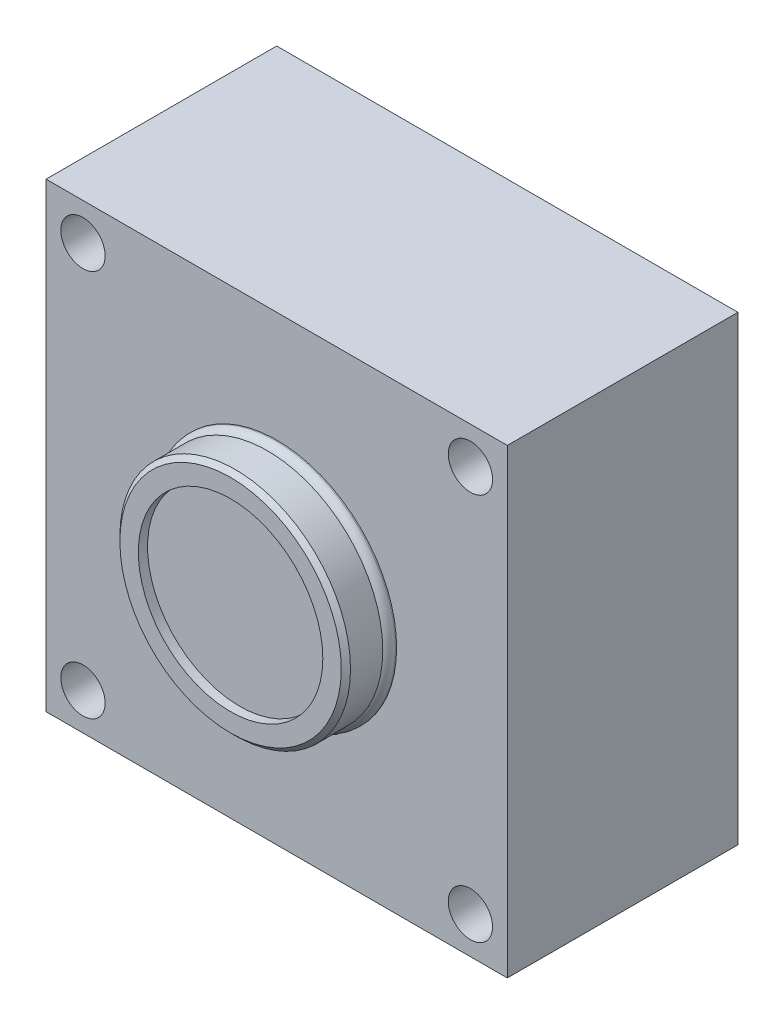
ISO-10303-21;
HEADER;
FILE_DESCRIPTION(('STEP AP214'),'2;1');
FILE_NAME('part.step','',(''),(''),'','','');
FILE_SCHEMA(('AUTOMOTIVE_DESIGN { 1 0 10303 214 1 1 1 1 }'));
ENDSEC;
DATA;
#1=APPLICATION_CONTEXT('core data for automotive mechanical design processes');
#2=APPLICATION_PROTOCOL_DEFINITION('international standard','automotive_design',2000,#1);
#3=PRODUCT_CONTEXT('',#1,'mechanical');
#4=PRODUCT('Part','Part','',(#3));
#5=PRODUCT_RELATED_PRODUCT_CATEGORY('part','',(#4));
#6=PRODUCT_DEFINITION_FORMATION('','',#4);
#7=PRODUCT_DEFINITION_CONTEXT('part definition',#1,'design');
#8=PRODUCT_DEFINITION('design','',#6,#7);
#9=PRODUCT_DEFINITION_SHAPE('','',#8);
#10=(LENGTH_UNIT() NAMED_UNIT(*) SI_UNIT(.MILLI.,.METRE.));
#11=(NAMED_UNIT(*) PLANE_ANGLE_UNIT() SI_UNIT($,.RADIAN.));
#12=(NAMED_UNIT(*) SI_UNIT($,.STERADIAN.) SOLID_ANGLE_UNIT());
#13=UNCERTAINTY_MEASURE_WITH_UNIT(LENGTH_MEASURE(1.E-05),#10,'distance_accuracy_value','');
#14=(GEOMETRIC_REPRESENTATION_CONTEXT(3) GLOBAL_UNCERTAINTY_ASSIGNED_CONTEXT((#13)) GLOBAL_UNIT_ASSIGNED_CONTEXT((#10,
#11,#12)) REPRESENTATION_CONTEXT('',''));
#15=CARTESIAN_POINT('',(0.,0.,0.));
#16=DIRECTION('',(0.,0.,1.));
#17=DIRECTION('',(1.,0.,0.));
#18=AXIS2_PLACEMENT_3D('',#15,#16,#17);
#19=CARTESIAN_POINT('',(25.,25.,12.5));
#20=DIRECTION('',(-1.,0.,0.));
#21=DIRECTION('',(0.,0.,1.));
#22=AXIS2_PLACEMENT_3D('',#19,#20,#21);
#23=PLANE('',#22);
#24=DIRECTION('',(0.,1.,0.));
#25=VECTOR('',#24,1.);
#26=CARTESIAN_POINT('',(25.,25.,-12.5));
#27=LINE('',#26,#25);
#28=CARTESIAN_POINT('',(25.,-25.,-12.5));
#29=VERTEX_POINT('',#28);
#30=CARTESIAN_POINT('',(25.,25.,-12.5));
#31=VERTEX_POINT('',#30);
#32=EDGE_CURVE('E199',#29,#31,#27,.T.);
#33=ORIENTED_EDGE('',*,*,#32,.T.);
#34=DIRECTION('',(0.,0.,-1.));
#35=VECTOR('',#34,1.);
#36=CARTESIAN_POINT('',(25.,25.,12.5));
#37=LINE('',#36,#35);
#38=CARTESIAN_POINT('',(25.,25.,12.5));
#39=VERTEX_POINT('',#38);
#40=EDGE_CURVE('E180',#39,#31,#37,.T.);
#41=ORIENTED_EDGE('',*,*,#40,.F.);
#42=DIRECTION('',(0.,1.,0.));
#43=VECTOR('',#42,1.);
#44=CARTESIAN_POINT('',(25.,25.,12.5));
#45=LINE('',#44,#43);
#46=CARTESIAN_POINT('',(25.,-25.,12.5));
#47=VERTEX_POINT('',#46);
#48=EDGE_CURVE('E187',#47,#39,#45,.T.);
#49=ORIENTED_EDGE('',*,*,#48,.F.);
#50=DIRECTION('',(0.,0.,-1.));
#51=VECTOR('',#50,1.);
#52=CARTESIAN_POINT('',(25.,-25.,12.5));
#53=LINE('',#52,#51);
#54=EDGE_CURVE('E391',#47,#29,#53,.T.);
#55=ORIENTED_EDGE('',*,*,#54,.T.);
#56=EDGE_LOOP('',(#33,#41,#49,#55));
#57=FACE_BOUND('',#56,.T.);
#58=ADVANCED_FACE('F41',(#57),#23,.F.);
#59=CARTESIAN_POINT('',(-25.,25.,12.5));
#60=DIRECTION('',(0.,-1.,0.));
#61=DIRECTION('',(0.,0.,-1.));
#62=AXIS2_PLACEMENT_3D('',#59,#60,#61);
#63=PLANE('',#62);
#64=DIRECTION('',(-1.,0.,0.));
#65=VECTOR('',#64,1.);
#66=CARTESIAN_POINT('',(-25.,25.,-12.5));
#67=LINE('',#66,#65);
#68=CARTESIAN_POINT('',(-25.,25.,-12.5));
#69=VERTEX_POINT('',#68);
#70=EDGE_CURVE('E393',#31,#69,#67,.T.);
#71=ORIENTED_EDGE('',*,*,#70,.T.);
#72=DIRECTION('',(0.,0.,-1.));
#73=VECTOR('',#72,1.);
#74=CARTESIAN_POINT('',(-25.,25.,12.5));
#75=LINE('',#74,#73);
#76=CARTESIAN_POINT('',(-25.,25.,12.5));
#77=VERTEX_POINT('',#76);
#78=EDGE_CURVE('E183',#77,#69,#75,.T.);
#79=ORIENTED_EDGE('',*,*,#78,.F.);
#80=DIRECTION('',(-1.,0.,0.));
#81=VECTOR('',#80,1.);
#82=CARTESIAN_POINT('',(-25.,25.,12.5));
#83=LINE('',#82,#81);
#84=EDGE_CURVE('E176',#39,#77,#83,.T.);
#85=ORIENTED_EDGE('',*,*,#84,.F.);
#86=ORIENTED_EDGE('',*,*,#40,.T.);
#87=EDGE_LOOP('',(#71,#79,#85,#86));
#88=FACE_BOUND('',#87,.T.);
#89=ADVANCED_FACE('F178',(#88),#63,.F.);
#90=CARTESIAN_POINT('',(-25.,25.,12.5));
#91=DIRECTION('',(1.,0.,0.));
#92=DIRECTION('',(0.,1.,0.));
#93=AXIS2_PLACEMENT_3D('',#90,#91,#92);
#94=PLANE('',#93);
#95=DIRECTION('',(0.,-1.,0.));
#96=VECTOR('',#95,1.);
#97=CARTESIAN_POINT('',(-25.,25.,-12.5));
#98=LINE('',#97,#96);
#99=CARTESIAN_POINT('',(-25.,-25.,-12.5));
#100=VERTEX_POINT('',#99);
#101=EDGE_CURVE('E395',#69,#100,#98,.T.);
#102=ORIENTED_EDGE('',*,*,#101,.T.);
#103=DIRECTION('',(0.,0.,-1.));
#104=VECTOR('',#103,1.);
#105=CARTESIAN_POINT('',(-25.,-25.,12.5));
#106=LINE('',#105,#104);
#107=CARTESIAN_POINT('',(-25.,-25.,12.5));
#108=VERTEX_POINT('',#107);
#109=EDGE_CURVE('E205',#108,#100,#106,.T.);
#110=ORIENTED_EDGE('',*,*,#109,.F.);
#111=DIRECTION('',(0.,-1.,0.));
#112=VECTOR('',#111,1.);
#113=CARTESIAN_POINT('',(-25.,25.,12.5));
#114=LINE('',#113,#112);
#115=EDGE_CURVE('E186',#77,#108,#114,.T.);
#116=ORIENTED_EDGE('',*,*,#115,.F.);
#117=ORIENTED_EDGE('',*,*,#78,.T.);
#118=EDGE_LOOP('',(#102,#110,#116,#117));
#119=FACE_BOUND('',#118,.T.);
#120=ADVANCED_FACE('F407',(#119),#94,.F.);
#121=CARTESIAN_POINT('',(-25.,-25.,12.5));
#122=DIRECTION('',(0.,1.,0.));
#123=DIRECTION('',(0.,0.,1.));
#124=AXIS2_PLACEMENT_3D('',#121,#122,#123);
#125=PLANE('',#124);
#126=CARTESIAN_POINT('',(-19.,-25.,-6.5));
#127=DIRECTION('',(0.,1.,0.));
#128=DIRECTION('',(0.,0.,1.));
#129=AXIS2_PLACEMENT_3D('',#126,#127,#128);
#130=CIRCLE('',#129,2.5);
#131=CARTESIAN_POINT('',(-19.,-25.,-4.));
#132=VERTEX_POINT('',#131);
#133=EDGE_CURVE('E11',#132,#132,#130,.F.);
#134=ORIENTED_EDGE('',*,*,#133,.F.);
#135=EDGE_LOOP('',(#134));
#136=FACE_BOUND('',#135,.T.);
#137=DIRECTION('',(1.,0.,0.));
#138=VECTOR('',#137,1.);
#139=CARTESIAN_POINT('',(-25.,-25.,-12.5));
#140=LINE('',#139,#138);
#141=EDGE_CURVE('E196',#100,#29,#140,.T.);
#142=ORIENTED_EDGE('',*,*,#141,.T.);
#143=ORIENTED_EDGE('',*,*,#54,.F.);
#144=DIRECTION('',(1.,0.,0.));
#145=VECTOR('',#144,1.);
#146=CARTESIAN_POINT('',(-25.,-25.,12.5));
#147=LINE('',#146,#145);
#148=EDGE_CURVE('E192',#108,#47,#147,.T.);
#149=ORIENTED_EDGE('',*,*,#148,.F.);
#150=ORIENTED_EDGE('',*,*,#109,.T.);
#151=EDGE_LOOP('',(#142,#143,#149,#150));
#152=FACE_BOUND('',#151,.T.);
#153=ADVANCED_FACE('F402',(#136,#152),#125,.F.);
#154=CARTESIAN_POINT('',(0.,0.,12.5));
#155=DIRECTION('',(0.,0.,1.));
#156=DIRECTION('',(1.,0.,0.));
#157=AXIS2_PLACEMENT_3D('',#154,#155,#156);
#158=PLANE('',#157);
#159=CARTESIAN_POINT('',(0.,0.,12.5));
#160=DIRECTION('',(0.,0.,1.));
#161=DIRECTION('',(1.,0.,0.));
#162=AXIS2_PLACEMENT_3D('',#159,#160,#161);
#163=CIRCLE('',#162,13.);
#164=CARTESIAN_POINT('',(13.,0.,12.5));
#165=VERTEX_POINT('',#164);
#166=EDGE_CURVE('E213',#165,#165,#163,.T.);
#167=ORIENTED_EDGE('',*,*,#166,.F.);
#168=EDGE_LOOP('',(#167));
#169=FACE_BOUND('',#168,.T.);
#170=CARTESIAN_POINT('',(21.,21.,12.5));
#171=DIRECTION('',(0.,0.,1.));
#172=DIRECTION('',(1.,0.,0.));
#173=AXIS2_PLACEMENT_3D('',#170,#171,#172);
#174=CIRCLE('',#173,2.4);
#175=CARTESIAN_POINT('',(23.4,21.,12.5));
#176=VERTEX_POINT('',#175);
#177=EDGE_CURVE('E372',#176,#176,#174,.T.);
#178=ORIENTED_EDGE('',*,*,#177,.F.);
#179=EDGE_LOOP('',(#178));
#180=FACE_BOUND('',#179,.T.);
#181=CARTESIAN_POINT('',(-21.,-21.,12.5));
#182=DIRECTION('',(0.,0.,1.));
#183=DIRECTION('',(1.,0.,0.));
#184=AXIS2_PLACEMENT_3D('',#181,#182,#183);
#185=CIRCLE('',#184,2.4);
#186=CARTESIAN_POINT('',(-18.6,-21.,12.5));
#187=VERTEX_POINT('',#186);
#188=EDGE_CURVE('E371',#187,#187,#185,.T.);
#189=ORIENTED_EDGE('',*,*,#188,.F.);
#190=EDGE_LOOP('',(#189));
#191=FACE_BOUND('',#190,.T.);
#192=CARTESIAN_POINT('',(21.,-21.,12.5));
#193=DIRECTION('',(0.,0.,1.));
#194=DIRECTION('',(1.,0.,0.));
#195=AXIS2_PLACEMENT_3D('',#192,#193,#194);
#196=CIRCLE('',#195,2.4);
#197=CARTESIAN_POINT('',(23.4,-21.,12.5));
#198=VERTEX_POINT('',#197);
#199=EDGE_CURVE('E212',#198,#198,#196,.T.);
#200=ORIENTED_EDGE('',*,*,#199,.F.);
#201=EDGE_LOOP('',(#200));
#202=FACE_BOUND('',#201,.T.);
#203=CARTESIAN_POINT('',(-21.,21.,12.5));
#204=DIRECTION('',(0.,0.,1.));
#205=DIRECTION('',(1.,0.,0.));
#206=AXIS2_PLACEMENT_3D('',#203,#204,#205);
#207=CIRCLE('',#206,2.4);
#208=CARTESIAN_POINT('',(-18.6,21.,12.5));
#209=VERTEX_POINT('',#208);
#210=EDGE_CURVE('E379',#209,#209,#207,.T.);
#211=ORIENTED_EDGE('',*,*,#210,.F.);
#212=EDGE_LOOP('',(#211));
#213=FACE_BOUND('',#212,.T.);
#214=ORIENTED_EDGE('',*,*,#48,.T.);
#215=ORIENTED_EDGE('',*,*,#84,.T.);
#216=ORIENTED_EDGE('',*,*,#115,.T.);
#217=ORIENTED_EDGE('',*,*,#148,.T.);
#218=EDGE_LOOP('',(#214,#215,#216,#217));
#219=FACE_BOUND('',#218,.T.);
#220=ADVANCED_FACE('F190',(#169,#180,#191,#202,#213,#219),#158,.T.);
#221=CARTESIAN_POINT('',(0.,0.,-12.5));
#222=DIRECTION('',(0.,0.,1.));
#223=DIRECTION('',(1.,0.,0.));
#224=AXIS2_PLACEMENT_3D('',#221,#222,#223);
#225=PLANE('',#224);
#226=CARTESIAN_POINT('',(21.,21.,-12.5));
#227=DIRECTION('',(0.,0.,1.));
#228=DIRECTION('',(1.,0.,0.));
#229=AXIS2_PLACEMENT_3D('',#226,#227,#228);
#230=CIRCLE('',#229,2.4);
#231=CARTESIAN_POINT('',(23.4,21.,-12.5));
#232=VERTEX_POINT('',#231);
#233=EDGE_CURVE('E375',#232,#232,#230,.F.);
#234=ORIENTED_EDGE('',*,*,#233,.F.);
#235=EDGE_LOOP('',(#234));
#236=FACE_BOUND('',#235,.T.);
#237=CARTESIAN_POINT('',(-21.,-21.,-12.5));
#238=DIRECTION('',(0.,0.,1.));
#239=DIRECTION('',(1.,0.,0.));
#240=AXIS2_PLACEMENT_3D('',#237,#238,#239);
#241=CIRCLE('',#240,2.4);
#242=CARTESIAN_POINT('',(-18.6,-21.,-12.5));
#243=VERTEX_POINT('',#242);
#244=EDGE_CURVE('E376',#243,#243,#241,.F.);
#245=ORIENTED_EDGE('',*,*,#244,.F.);
#246=EDGE_LOOP('',(#245));
#247=FACE_BOUND('',#246,.T.);
#248=CARTESIAN_POINT('',(21.,-21.,-12.5));
#249=DIRECTION('',(0.,0.,1.));
#250=DIRECTION('',(1.,0.,0.));
#251=AXIS2_PLACEMENT_3D('',#248,#249,#250);
#252=CIRCLE('',#251,2.4);
#253=CARTESIAN_POINT('',(23.4,-21.,-12.5));
#254=VERTEX_POINT('',#253);
#255=EDGE_CURVE('E368',#254,#254,#252,.F.);
#256=ORIENTED_EDGE('',*,*,#255,.F.);
#257=EDGE_LOOP('',(#256));
#258=FACE_BOUND('',#257,.T.);
#259=CARTESIAN_POINT('',(-21.,21.,-12.5));
#260=DIRECTION('',(0.,0.,1.));
#261=DIRECTION('',(1.,0.,0.));
#262=AXIS2_PLACEMENT_3D('',#259,#260,#261);
#263=CIRCLE('',#262,2.4);
#264=CARTESIAN_POINT('',(-18.6,21.,-12.5));
#265=VERTEX_POINT('',#264);
#266=EDGE_CURVE('E386',#265,#265,#263,.F.);
#267=ORIENTED_EDGE('',*,*,#266,.F.);
#268=EDGE_LOOP('',(#267));
#269=FACE_BOUND('',#268,.T.);
#270=ORIENTED_EDGE('',*,*,#32,.F.);
#271=ORIENTED_EDGE('',*,*,#141,.F.);
#272=ORIENTED_EDGE('',*,*,#101,.F.);
#273=ORIENTED_EDGE('',*,*,#70,.F.);
#274=EDGE_LOOP('',(#270,#271,#272,#273));
#275=FACE_BOUND('',#274,.T.);
#276=ADVANCED_FACE('F406',(#236,#247,#258,#269,#275),#225,.F.);
#277=CARTESIAN_POINT('',(-21.,21.,-12.501));
#278=DIRECTION('',(0.,0.,1.));
#279=DIRECTION('',(1.,0.,0.));
#280=AXIS2_PLACEMENT_3D('',#277,#278,#279);
#281=CYLINDRICAL_SURFACE('',#280,2.4);
#282=ORIENTED_EDGE('',*,*,#210,.T.);
#283=EDGE_LOOP('',(#282));
#284=FACE_BOUND('',#283,.T.);
#285=ORIENTED_EDGE('',*,*,#266,.T.);
#286=EDGE_LOOP('',(#285));
#287=FACE_BOUND('',#286,.T.);
#288=ADVANCED_FACE('F529',(#284,#287),#281,.F.);
#289=CARTESIAN_POINT('',(21.,-21.,-12.501));
#290=DIRECTION('',(0.,0.,1.));
#291=DIRECTION('',(1.,0.,0.));
#292=AXIS2_PLACEMENT_3D('',#289,#290,#291);
#293=CYLINDRICAL_SURFACE('',#292,2.4);
#294=ORIENTED_EDGE('',*,*,#199,.T.);
#295=EDGE_LOOP('',(#294));
#296=FACE_BOUND('',#295,.T.);
#297=ORIENTED_EDGE('',*,*,#255,.T.);
#298=EDGE_LOOP('',(#297));
#299=FACE_BOUND('',#298,.T.);
#300=ADVANCED_FACE('F534',(#296,#299),#293,.F.);
#301=CARTESIAN_POINT('',(-21.,-21.,-12.501));
#302=DIRECTION('',(0.,0.,1.));
#303=DIRECTION('',(1.,0.,0.));
#304=AXIS2_PLACEMENT_3D('',#301,#302,#303);
#305=CYLINDRICAL_SURFACE('',#304,2.4);
#306=ORIENTED_EDGE('',*,*,#188,.T.);
#307=EDGE_LOOP('',(#306));
#308=FACE_BOUND('',#307,.T.);
#309=ORIENTED_EDGE('',*,*,#244,.T.);
#310=EDGE_LOOP('',(#309));
#311=FACE_BOUND('',#310,.T.);
#312=ADVANCED_FACE('F546',(#308,#311),#305,.F.);
#313=CARTESIAN_POINT('',(21.,21.,-12.501));
#314=DIRECTION('',(0.,0.,1.));
#315=DIRECTION('',(1.,0.,0.));
#316=AXIS2_PLACEMENT_3D('',#313,#314,#315);
#317=CYLINDRICAL_SURFACE('',#316,2.4);
#318=ORIENTED_EDGE('',*,*,#177,.T.);
#319=EDGE_LOOP('',(#318));
#320=FACE_BOUND('',#319,.T.);
#321=ORIENTED_EDGE('',*,*,#233,.T.);
#322=EDGE_LOOP('',(#321));
#323=FACE_BOUND('',#322,.T.);
#324=ADVANCED_FACE('F552',(#320,#323),#317,.F.);
#325=CARTESIAN_POINT('',(0.,0.,13.5));
#326=DIRECTION('',(0.,0.,-1.));
#327=DIRECTION('',(-1.,0.,0.));
#328=AXIS2_PLACEMENT_3D('',#325,#326,#327);
#329=CYLINDRICAL_SURFACE('',#328,13.);
#330=CARTESIAN_POINT('',(0.,0.,12.6339745962156));
#331=DIRECTION('',(0.,0.,1.));
#332=DIRECTION('',(1.,0.,0.));
#333=AXIS2_PLACEMENT_3D('',#330,#331,#332);
#334=CIRCLE('',#333,13.);
#335=CARTESIAN_POINT('',(13.,0.,12.6339745962156));
#336=VERTEX_POINT('',#335);
#337=EDGE_CURVE('E330',#336,#336,#334,.F.);
#338=ORIENTED_EDGE('',*,*,#337,.T.);
#339=EDGE_LOOP('',(#338));
#340=FACE_BOUND('',#339,.T.);
#341=ORIENTED_EDGE('',*,*,#166,.T.);
#342=EDGE_LOOP('',(#341));
#343=FACE_BOUND('',#342,.T.);
#344=ADVANCED_FACE('F350',(#340,#343),#329,.T.);
#345=CARTESIAN_POINT('',(0.,0.,17.5));
#346=DIRECTION('',(0.,0.,1.));
#347=DIRECTION('',(1.,0.,0.));
#348=AXIS2_PLACEMENT_3D('',#345,#346,#347);
#349=PLANE('',#348);
#350=CARTESIAN_POINT('',(0.,0.,17.5));
#351=DIRECTION('',(0.,0.,1.));
#352=DIRECTION('',(1.,0.,0.));
#353=AXIS2_PLACEMENT_3D('',#350,#351,#352);
#354=CIRCLE('',#353,12.);
#355=CARTESIAN_POINT('',(12.,0.,17.5));
#356=VERTEX_POINT('',#355);
#357=EDGE_CURVE('E333',#356,#356,#354,.T.);
#358=ORIENTED_EDGE('',*,*,#357,.T.);
#359=EDGE_LOOP('',(#358));
#360=FACE_BOUND('',#359,.T.);
#361=CARTESIAN_POINT('',(0.,0.,17.5));
#362=DIRECTION('',(0.,0.,1.));
#363=DIRECTION('',(1.,0.,0.));
#364=AXIS2_PLACEMENT_3D('',#361,#362,#363);
#365=CIRCLE('',#364,10.);
#366=CARTESIAN_POINT('',(10.,0.,17.5));
#367=VERTEX_POINT('',#366);
#368=EDGE_CURVE('E354',#367,#367,#365,.T.);
#369=ORIENTED_EDGE('',*,*,#368,.F.);
#370=EDGE_LOOP('',(#369));
#371=FACE_BOUND('',#370,.T.);
#372=ADVANCED_FACE('F347',(#360,#371),#349,.T.);
#373=CARTESIAN_POINT('',(0.,0.,17.5));
#374=DIRECTION('',(0.,0.,-1.));
#375=DIRECTION('',(-1.,0.,0.));
#376=AXIS2_PLACEMENT_3D('',#373,#374,#375);
#377=CYLINDRICAL_SURFACE('',#376,12.5);
#378=CARTESIAN_POINT('',(0.,0.,17.));
#379=DIRECTION('',(0.,0.,1.));
#380=DIRECTION('',(1.,0.,0.));
#381=AXIS2_PLACEMENT_3D('',#378,#379,#380);
#382=CIRCLE('',#381,12.5);
#383=CARTESIAN_POINT('',(12.5,0.,17.));
#384=VERTEX_POINT('',#383);
#385=EDGE_CURVE('E51',#384,#384,#382,.F.);
#386=ORIENTED_EDGE('',*,*,#385,.T.);
#387=EDGE_LOOP('',(#386));
#388=FACE_BOUND('',#387,.T.);
#389=CARTESIAN_POINT('',(0.,0.,13.5));
#390=DIRECTION('',(0.,0.,1.));
#391=DIRECTION('',(1.,0.,0.));
#392=AXIS2_PLACEMENT_3D('',#389,#390,#391);
#393=CIRCLE('',#392,12.5);
#394=CARTESIAN_POINT('',(12.5,0.,13.5));
#395=VERTEX_POINT('',#394);
#396=EDGE_CURVE('E209',#395,#395,#393,.T.);
#397=ORIENTED_EDGE('',*,*,#396,.T.);
#398=EDGE_LOOP('',(#397));
#399=FACE_BOUND('',#398,.T.);
#400=ADVANCED_FACE('F338',(#388,#399),#377,.T.);
#401=CARTESIAN_POINT('',(0.,0.,16.5));
#402=DIRECTION('',(0.,0.,1.));
#403=DIRECTION('',(1.,0.,0.));
#404=AXIS2_PLACEMENT_3D('',#401,#402,#403);
#405=CYLINDRICAL_SURFACE('',#404,10.);
#406=CARTESIAN_POINT('',(0.,0.,16.5));
#407=DIRECTION('',(0.,0.,1.));
#408=DIRECTION('',(1.,0.,0.));
#409=AXIS2_PLACEMENT_3D('',#406,#407,#408);
#410=CIRCLE('',#409,10.);
#411=CARTESIAN_POINT('',(10.,0.,16.5));
#412=VERTEX_POINT('',#411);
#413=EDGE_CURVE('E356',#412,#412,#410,.T.);
#414=ORIENTED_EDGE('',*,*,#413,.F.);
#415=EDGE_LOOP('',(#414));
#416=FACE_BOUND('',#415,.T.);
#417=ORIENTED_EDGE('',*,*,#368,.T.);
#418=EDGE_LOOP('',(#417));
#419=FACE_BOUND('',#418,.T.);
#420=ADVANCED_FACE('F510',(#416,#419),#405,.F.);
#421=CARTESIAN_POINT('',(0.,0.,16.5));
#422=DIRECTION('',(0.,0.,1.));
#423=DIRECTION('',(1.,0.,0.));
#424=AXIS2_PLACEMENT_3D('',#421,#422,#423);
#425=PLANE('',#424);
#426=ORIENTED_EDGE('',*,*,#413,.T.);
#427=EDGE_LOOP('',(#426));
#428=FACE_BOUND('',#427,.T.);
#429=ADVANCED_FACE('F505',(#428),#425,.T.);
#430=CARTESIAN_POINT('',(0.,0.,12.6339745962156));
#431=DIRECTION('',(0.,0.,1.));
#432=DIRECTION('',(1.,0.,0.));
#433=AXIS2_PLACEMENT_3D('',#430,#431,#432);
#434=TOROIDAL_SURFACE('',#433,12.,1.);
#435=ORIENTED_EDGE('',*,*,#337,.F.);
#436=EDGE_LOOP('',(#435));
#437=FACE_BOUND('',#436,.T.);
#438=ORIENTED_EDGE('',*,*,#396,.F.);
#439=EDGE_LOOP('',(#438));
#440=FACE_BOUND('',#439,.T.);
#441=ADVANCED_FACE('F344',(#437,#440),#434,.T.);
#442=CARTESIAN_POINT('',(0.,0.,17.5));
#443=DIRECTION('',(0.,0.,-1.));
#444=DIRECTION('',(-1.,0.,0.));
#445=AXIS2_PLACEMENT_3D('',#442,#443,#444);
#446=CONICAL_SURFACE('',#445,12.,0.785398163397438);
#447=ORIENTED_EDGE('',*,*,#385,.F.);
#448=EDGE_LOOP('',(#447));
#449=FACE_BOUND('',#448,.T.);
#450=ORIENTED_EDGE('',*,*,#357,.F.);
#451=EDGE_LOOP('',(#450));
#452=FACE_BOUND('',#451,.T.);
#453=ADVANCED_FACE('F44',(#449,#452),#446,.T.);
#454=CARTESIAN_POINT('',(-19.,-25.,-6.5));
#455=DIRECTION('',(0.,1.,0.));
#456=DIRECTION('',(0.,0.,-1.));
#457=AXIS2_PLACEMENT_3D('',#454,#455,#456);
#458=CONICAL_SURFACE('',#457,2.5,0.0872664625997167);
#459=CARTESIAN_POINT('',(-19.,-33.,-6.5));
#460=DIRECTION('',(0.,-1.,0.));
#461=DIRECTION('',(0.,0.,-1.));
#462=AXIS2_PLACEMENT_3D('',#459,#460,#461);
#463=CIRCLE('',#462,1.8000906917926);
#464=CARTESIAN_POINT('',(-19.,-33.,-8.3000906917926));
#465=VERTEX_POINT('',#464);
#466=EDGE_CURVE('E357',#465,#465,#463,.T.);
#467=ORIENTED_EDGE('',*,*,#466,.F.);
#468=EDGE_LOOP('',(#467));
#469=FACE_BOUND('',#468,.T.);
#470=ORIENTED_EDGE('',*,*,#133,.T.);
#471=EDGE_LOOP('',(#470));
#472=FACE_BOUND('',#471,.T.);
#473=ADVANCED_FACE('F343',(#469,#472),#458,.T.);
#474=CARTESIAN_POINT('',(-19.,-33.,-6.5));
#475=DIRECTION('',(0.,-1.,0.));
#476=DIRECTION('',(0.,0.,-1.));
#477=AXIS2_PLACEMENT_3D('',#474,#475,#476);
#478=PLANE('',#477);
#479=ORIENTED_EDGE('',*,*,#466,.T.);
#480=EDGE_LOOP('',(#479));
#481=FACE_BOUND('',#480,.T.);
#482=ADVANCED_FACE('F613',(#481),#478,.T.);
#483=CLOSED_SHELL('',(#58,#89,#120,#153,#220,#276,#288,#300,#312,#324,#344,#372,#400,#420,#429,
#441,#453,#473,#482));
#484=CARTESIAN_POINT('',(23.,25.,12.5));
#485=DIRECTION('',(-1.,0.,0.));
#486=DIRECTION('',(0.,0.,1.));
#487=AXIS2_PLACEMENT_3D('',#484,#485,#486);
#488=PLANE('',#487);
#489=DIRECTION('',(0.,1.,0.));
#490=VECTOR('',#489,1.);
#491=CARTESIAN_POINT('',(23.,25.,10.5));
#492=LINE('',#491,#490);
#493=CARTESIAN_POINT('',(23.,-17.0808164115469,10.5));
#494=VERTEX_POINT('',#493);
#495=CARTESIAN_POINT('',(23.,13.6678788880707,10.5));
#496=VERTEX_POINT('',#495);
#497=EDGE_CURVE('E251',#494,#496,#492,.T.);
#498=ORIENTED_EDGE('',*,*,#497,.T.);
#499=DIRECTION('',(0.,0.,-1.));
#500=VECTOR('',#499,1.);
#501=CARTESIAN_POINT('',(23.,13.6678788880707,-10.5));
#502=LINE('',#501,#500);
#503=CARTESIAN_POINT('',(23.,13.6678788880707,-10.5));
#504=VERTEX_POINT('',#503);
#505=EDGE_CURVE('E306',#496,#504,#502,.T.);
#506=ORIENTED_EDGE('',*,*,#505,.T.);
#507=DIRECTION('',(0.,1.,0.));
#508=VECTOR('',#507,1.);
#509=CARTESIAN_POINT('',(23.,25.,-10.5));
#510=LINE('',#509,#508);
#511=CARTESIAN_POINT('',(23.,-17.0808164115469,-10.5));
#512=VERTEX_POINT('',#511);
#513=EDGE_CURVE('E200',#512,#504,#510,.T.);
#514=ORIENTED_EDGE('',*,*,#513,.F.);
#515=DIRECTION('',(0.,0.,1.));
#516=VECTOR('',#515,1.);
#517=CARTESIAN_POINT('',(23.,-17.0808164115469,-12.501));
#518=LINE('',#517,#516);
#519=EDGE_CURVE('E242',#512,#494,#518,.T.);
#520=ORIENTED_EDGE('',*,*,#519,.T.);
#521=EDGE_LOOP('',(#498,#506,#514,#520));
#522=FACE_BOUND('',#521,.T.);
#523=ADVANCED_FACE('F422',(#522),#488,.T.);
#524=CARTESIAN_POINT('',(-25.,23.,12.5));
#525=DIRECTION('',(0.,-1.,0.));
#526=DIRECTION('',(0.,0.,-1.));
#527=AXIS2_PLACEMENT_3D('',#524,#525,#526);
#528=PLANE('',#527);
#529=DIRECTION('',(-1.,0.,0.));
#530=VECTOR('',#529,1.);
#531=CARTESIAN_POINT('',(-25.,23.,-10.5));
#532=LINE('',#531,#530);
#533=CARTESIAN_POINT('',(13.6678788880707,23.,-10.5));
#534=VERTEX_POINT('',#533);
#535=CARTESIAN_POINT('',(-13.6678788880707,23.,-10.5));
#536=VERTEX_POINT('',#535);
#537=EDGE_CURVE('E203',#534,#536,#532,.T.);
#538=ORIENTED_EDGE('',*,*,#537,.F.);
#539=DIRECTION('',(0.,0.,-1.));
#540=VECTOR('',#539,1.);
#541=CARTESIAN_POINT('',(13.6678788880707,23.,10.5));
#542=LINE('',#541,#540);
#543=CARTESIAN_POINT('',(13.6678788880707,23.,10.5));
#544=VERTEX_POINT('',#543);
#545=EDGE_CURVE('E271',#534,#544,#542,.F.);
#546=ORIENTED_EDGE('',*,*,#545,.T.);
#547=DIRECTION('',(-1.,0.,0.));
#548=VECTOR('',#547,1.);
#549=CARTESIAN_POINT('',(-25.,23.,10.5));
#550=LINE('',#549,#548);
#551=CARTESIAN_POINT('',(-13.6678788880707,23.,10.5));
#552=VERTEX_POINT('',#551);
#553=EDGE_CURVE('E260',#544,#552,#550,.T.);
#554=ORIENTED_EDGE('',*,*,#553,.T.);
#555=DIRECTION('',(0.,0.,-1.));
#556=VECTOR('',#555,1.);
#557=CARTESIAN_POINT('',(-13.6678788880707,23.,-10.5));
#558=LINE('',#557,#556);
#559=EDGE_CURVE('E217',#552,#536,#558,.T.);
#560=ORIENTED_EDGE('',*,*,#559,.T.);
#561=EDGE_LOOP('',(#538,#546,#554,#560));
#562=FACE_BOUND('',#561,.T.);
#563=ADVANCED_FACE('F425',(#562),#528,.T.);
#564=CARTESIAN_POINT('',(-23.,25.,12.5));
#565=DIRECTION('',(1.,0.,0.));
#566=DIRECTION('',(0.,1.,0.));
#567=AXIS2_PLACEMENT_3D('',#564,#565,#566);
#568=PLANE('',#567);
#569=DIRECTION('',(0.,-1.,0.));
#570=VECTOR('',#569,1.);
#571=CARTESIAN_POINT('',(-23.,25.,10.5));
#572=LINE('',#571,#570);
#573=CARTESIAN_POINT('',(-23.,13.6678788880707,10.5));
#574=VERTEX_POINT('',#573);
#575=CARTESIAN_POINT('',(-23.,-13.6678788880707,10.5));
#576=VERTEX_POINT('',#575);
#577=EDGE_CURVE('E257',#574,#576,#572,.T.);
#578=ORIENTED_EDGE('',*,*,#577,.T.);
#579=DIRECTION('',(0.,0.,-1.));
#580=VECTOR('',#579,1.);
#581=CARTESIAN_POINT('',(-23.,-13.6678788880707,-10.5));
#582=LINE('',#581,#580);
#583=CARTESIAN_POINT('',(-23.,-13.6678788880707,-10.5));
#584=VERTEX_POINT('',#583);
#585=EDGE_CURVE('E324',#576,#584,#582,.T.);
#586=ORIENTED_EDGE('',*,*,#585,.T.);
#587=DIRECTION('',(0.,-1.,0.));
#588=VECTOR('',#587,1.);
#589=CARTESIAN_POINT('',(-23.,25.,-10.5));
#590=LINE('',#589,#588);
#591=CARTESIAN_POINT('',(-23.,13.6678788880707,-10.5));
#592=VERTEX_POINT('',#591);
#593=EDGE_CURVE('E266',#592,#584,#590,.T.);
#594=ORIENTED_EDGE('',*,*,#593,.F.);
#595=DIRECTION('',(0.,0.,-1.));
#596=VECTOR('',#595,1.);
#597=CARTESIAN_POINT('',(-23.,13.6678788880707,10.5));
#598=LINE('',#597,#596);
#599=EDGE_CURVE('E321',#592,#574,#598,.F.);
#600=ORIENTED_EDGE('',*,*,#599,.T.);
#601=EDGE_LOOP('',(#578,#586,#594,#600));
#602=FACE_BOUND('',#601,.T.);
#603=ADVANCED_FACE('F430',(#602),#568,.T.);
#604=CARTESIAN_POINT('',(-25.,-23.,12.5));
#605=DIRECTION('',(0.,1.,0.));
#606=DIRECTION('',(0.,0.,1.));
#607=AXIS2_PLACEMENT_3D('',#604,#605,#606);
#608=PLANE('',#607);
#609=DIRECTION('',(1.,0.,0.));
#610=VECTOR('',#609,1.);
#611=CARTESIAN_POINT('',(-25.,-23.,10.5));
#612=LINE('',#611,#610);
#613=CARTESIAN_POINT('',(-13.6678788880707,-23.,10.5));
#614=VERTEX_POINT('',#613);
#615=CARTESIAN_POINT('',(13.6678788880707,-23.,10.5));
#616=VERTEX_POINT('',#615);
#617=EDGE_CURVE('E254',#614,#616,#612,.T.);
#618=ORIENTED_EDGE('',*,*,#617,.T.);
#619=DIRECTION('',(0.,0.,-1.));
#620=VECTOR('',#619,1.);
#621=CARTESIAN_POINT('',(13.6678788880707,-23.,-10.5));
#622=LINE('',#621,#620);
#623=CARTESIAN_POINT('',(13.6678788880707,-23.,-10.5));
#624=VERTEX_POINT('',#623);
#625=EDGE_CURVE('E314',#616,#624,#622,.T.);
#626=ORIENTED_EDGE('',*,*,#625,.T.);
#627=DIRECTION('',(1.,0.,0.));
#628=VECTOR('',#627,1.);
#629=CARTESIAN_POINT('',(-25.,-23.,-10.5));
#630=LINE('',#629,#628);
#631=CARTESIAN_POINT('',(-13.6678788880707,-23.,-10.5));
#632=VERTEX_POINT('',#631);
#633=EDGE_CURVE('E263',#632,#624,#630,.T.);
#634=ORIENTED_EDGE('',*,*,#633,.F.);
#635=DIRECTION('',(0.,0.,-1.));
#636=VECTOR('',#635,1.);
#637=CARTESIAN_POINT('',(-13.6678788880707,-23.,10.5));
#638=LINE('',#637,#636);
#639=EDGE_CURVE('E311',#632,#614,#638,.F.);
#640=ORIENTED_EDGE('',*,*,#639,.T.);
#641=EDGE_LOOP('',(#618,#626,#634,#640));
#642=FACE_BOUND('',#641,.T.);
#643=ADVANCED_FACE('F434',(#642),#608,.T.);
#644=CARTESIAN_POINT('',(0.,0.,10.5));
#645=DIRECTION('',(0.,0.,1.));
#646=DIRECTION('',(1.,0.,0.));
#647=AXIS2_PLACEMENT_3D('',#644,#645,#646);
#648=PLANE('',#647);
#649=CARTESIAN_POINT('',(0.,0.,10.5));
#650=DIRECTION('',(0.,0.,1.));
#651=DIRECTION('',(1.,0.,0.));
#652=AXIS2_PLACEMENT_3D('',#649,#650,#651);
#653=CIRCLE('',#652,11.);
#654=CARTESIAN_POINT('',(11.,0.,10.5));
#655=VERTEX_POINT('',#654);
#656=EDGE_CURVE('E224',#655,#655,#653,.T.);
#657=ORIENTED_EDGE('',*,*,#656,.T.);
#658=EDGE_LOOP('',(#657));
#659=FACE_BOUND('',#658,.T.);
#660=ORIENTED_EDGE('',*,*,#553,.F.);
#661=CARTESIAN_POINT('',(13.6678788880707,20.,10.5));
#662=DIRECTION('',(0.,0.,1.));
#663=DIRECTION('',(1.,0.,0.));
#664=AXIS2_PLACEMENT_3D('',#661,#662,#663);
#665=CIRCLE('',#664,3.);
#666=CARTESIAN_POINT('',(16.6403604199339,20.4054054054054,10.5));
#667=VERTEX_POINT('',#666);
#668=EDGE_CURVE('E286',#544,#667,#665,.F.);
#669=ORIENTED_EDGE('',*,*,#668,.T.);
#670=CARTESIAN_POINT('',(21.,21.,10.5));
#671=DIRECTION('',(0.,0.,1.));
#672=DIRECTION('',(1.,0.,0.));
#673=AXIS2_PLACEMENT_3D('',#670,#671,#672);
#674=CIRCLE('',#673,4.4);
#675=CARTESIAN_POINT('',(20.4054054054054,16.6403604199339,10.5));
#676=VERTEX_POINT('',#675);
#677=EDGE_CURVE('E227',#667,#676,#674,.T.);
#678=ORIENTED_EDGE('',*,*,#677,.T.);
#679=CARTESIAN_POINT('',(20.,13.6678788880707,10.5));
#680=DIRECTION('',(0.,0.,1.));
#681=DIRECTION('',(1.,0.,0.));
#682=AXIS2_PLACEMENT_3D('',#679,#680,#681);
#683=CIRCLE('',#682,3.);
#684=EDGE_CURVE('E284',#676,#496,#683,.F.);
#685=ORIENTED_EDGE('',*,*,#684,.T.);
#686=ORIENTED_EDGE('',*,*,#497,.F.);
#687=CARTESIAN_POINT('',(21.,-21.,10.5));
#688=DIRECTION('',(0.,0.,1.));
#689=DIRECTION('',(1.,0.,0.));
#690=AXIS2_PLACEMENT_3D('',#687,#688,#689);
#691=CIRCLE('',#690,4.4);
#692=CARTESIAN_POINT('',(16.6403604199339,-20.4054054054054,10.5));
#693=VERTEX_POINT('',#692);
#694=EDGE_CURVE('E239',#494,#693,#691,.T.);
#695=ORIENTED_EDGE('',*,*,#694,.T.);
#696=CARTESIAN_POINT('',(13.6678788880707,-20.,10.5));
#697=DIRECTION('',(0.,0.,1.));
#698=DIRECTION('',(1.,0.,0.));
#699=AXIS2_PLACEMENT_3D('',#696,#697,#698);
#700=CIRCLE('',#699,3.);
#701=EDGE_CURVE('E282',#693,#616,#700,.F.);
#702=ORIENTED_EDGE('',*,*,#701,.T.);
#703=ORIENTED_EDGE('',*,*,#617,.F.);
#704=CARTESIAN_POINT('',(-13.6678788880707,-20.,10.5));
#705=DIRECTION('',(0.,0.,1.));
#706=DIRECTION('',(1.,0.,0.));
#707=AXIS2_PLACEMENT_3D('',#704,#705,#706);
#708=CIRCLE('',#707,3.);
#709=CARTESIAN_POINT('',(-16.6403604199339,-20.4054054054054,10.5));
#710=VERTEX_POINT('',#709);
#711=EDGE_CURVE('E280',#614,#710,#708,.F.);
#712=ORIENTED_EDGE('',*,*,#711,.T.);
#713=CARTESIAN_POINT('',(-21.,-21.,10.5));
#714=DIRECTION('',(0.,0.,1.));
#715=DIRECTION('',(1.,0.,0.));
#716=AXIS2_PLACEMENT_3D('',#713,#714,#715);
#717=CIRCLE('',#716,4.4);
#718=CARTESIAN_POINT('',(-20.4054054054054,-16.6403604199339,10.5));
#719=VERTEX_POINT('',#718);
#720=EDGE_CURVE('E233',#710,#719,#717,.T.);
#721=ORIENTED_EDGE('',*,*,#720,.T.);
#722=CARTESIAN_POINT('',(-20.,-13.6678788880707,10.5));
#723=DIRECTION('',(0.,0.,1.));
#724=DIRECTION('',(1.,0.,0.));
#725=AXIS2_PLACEMENT_3D('',#722,#723,#724);
#726=CIRCLE('',#725,3.);
#727=EDGE_CURVE('E278',#719,#576,#726,.F.);
#728=ORIENTED_EDGE('',*,*,#727,.T.);
#729=ORIENTED_EDGE('',*,*,#577,.F.);
#730=CARTESIAN_POINT('',(-20.,13.6678788880707,10.5));
#731=DIRECTION('',(0.,0.,1.));
#732=DIRECTION('',(1.,0.,0.));
#733=AXIS2_PLACEMENT_3D('',#730,#731,#732);
#734=CIRCLE('',#733,3.);
#735=CARTESIAN_POINT('',(-20.4054054054054,16.6403604199339,10.5));
#736=VERTEX_POINT('',#735);
#737=EDGE_CURVE('E276',#574,#736,#734,.F.);
#738=ORIENTED_EDGE('',*,*,#737,.T.);
#739=CARTESIAN_POINT('',(-21.,21.,10.5));
#740=DIRECTION('',(0.,0.,1.));
#741=DIRECTION('',(1.,0.,0.));
#742=AXIS2_PLACEMENT_3D('',#739,#740,#741);
#743=CIRCLE('',#742,4.4);
#744=CARTESIAN_POINT('',(-16.6403604199339,20.4054054054054,10.5));
#745=VERTEX_POINT('',#744);
#746=EDGE_CURVE('E246',#736,#745,#743,.T.);
#747=ORIENTED_EDGE('',*,*,#746,.T.);
#748=CARTESIAN_POINT('',(-13.6678788880707,20.,10.5));
#749=DIRECTION('',(0.,0.,1.));
#750=DIRECTION('',(1.,0.,0.));
#751=AXIS2_PLACEMENT_3D('',#748,#749,#750);
#752=CIRCLE('',#751,3.);
#753=EDGE_CURVE('E274',#745,#552,#752,.F.);
#754=ORIENTED_EDGE('',*,*,#753,.T.);
#755=EDGE_LOOP('',(#660,#669,#678,#685,#686,#695,#702,#703,#712,#721,#728,#729,#738,#747,#754));
#756=FACE_BOUND('',#755,.T.);
#757=ADVANCED_FACE('F438',(#659,#756),#648,.F.);
#758=CARTESIAN_POINT('',(0.,0.,-10.5));
#759=DIRECTION('',(0.,0.,1.));
#760=DIRECTION('',(1.,0.,0.));
#761=AXIS2_PLACEMENT_3D('',#758,#759,#760);
#762=PLANE('',#761);
#763=CARTESIAN_POINT('',(21.,21.,-10.5));
#764=DIRECTION('',(0.,0.,1.));
#765=DIRECTION('',(1.,0.,0.));
#766=AXIS2_PLACEMENT_3D('',#763,#764,#765);
#767=CIRCLE('',#766,4.4);
#768=CARTESIAN_POINT('',(20.4054054054054,16.6403604199339,-10.5));
#769=VERTEX_POINT('',#768);
#770=CARTESIAN_POINT('',(16.6403604199339,20.4054054054054,-10.5));
#771=VERTEX_POINT('',#770);
#772=EDGE_CURVE('E230',#769,#771,#767,.F.);
#773=ORIENTED_EDGE('',*,*,#772,.T.);
#774=CARTESIAN_POINT('',(13.6678788880707,20.,-10.5));
#775=DIRECTION('',(0.,0.,1.));
#776=DIRECTION('',(1.,0.,0.));
#777=AXIS2_PLACEMENT_3D('',#774,#775,#776);
#778=CIRCLE('',#777,3.);
#779=EDGE_CURVE('E304',#771,#534,#778,.T.);
#780=ORIENTED_EDGE('',*,*,#779,.T.);
#781=ORIENTED_EDGE('',*,*,#537,.T.);
#782=CARTESIAN_POINT('',(-13.6678788880707,20.,-10.5));
#783=DIRECTION('',(0.,0.,1.));
#784=DIRECTION('',(1.,0.,0.));
#785=AXIS2_PLACEMENT_3D('',#782,#783,#784);
#786=CIRCLE('',#785,3.);
#787=CARTESIAN_POINT('',(-16.6403604199339,20.4054054054054,-10.5));
#788=VERTEX_POINT('',#787);
#789=EDGE_CURVE('E65',#536,#788,#786,.T.);
#790=ORIENTED_EDGE('',*,*,#789,.T.);
#791=CARTESIAN_POINT('',(-21.,21.,-10.5));
#792=DIRECTION('',(0.,0.,1.));
#793=DIRECTION('',(1.,0.,0.));
#794=AXIS2_PLACEMENT_3D('',#791,#792,#793);
#795=CIRCLE('',#794,4.4);
#796=CARTESIAN_POINT('',(-20.4054054054054,16.6403604199339,-10.5));
#797=VERTEX_POINT('',#796);
#798=EDGE_CURVE('E249',#788,#797,#795,.F.);
#799=ORIENTED_EDGE('',*,*,#798,.T.);
#800=CARTESIAN_POINT('',(-20.,13.6678788880707,-10.5));
#801=DIRECTION('',(0.,0.,1.));
#802=DIRECTION('',(1.,0.,0.));
#803=AXIS2_PLACEMENT_3D('',#800,#801,#802);
#804=CIRCLE('',#803,3.);
#805=EDGE_CURVE('E294',#797,#592,#804,.T.);
#806=ORIENTED_EDGE('',*,*,#805,.T.);
#807=ORIENTED_EDGE('',*,*,#593,.T.);
#808=CARTESIAN_POINT('',(-20.,-13.6678788880707,-10.5));
#809=DIRECTION('',(0.,0.,1.));
#810=DIRECTION('',(1.,0.,0.));
#811=AXIS2_PLACEMENT_3D('',#808,#809,#810);
#812=CIRCLE('',#811,3.);
#813=CARTESIAN_POINT('',(-20.4054054054054,-16.6403604199339,-10.5));
#814=VERTEX_POINT('',#813);
#815=EDGE_CURVE('E296',#584,#814,#812,.T.);
#816=ORIENTED_EDGE('',*,*,#815,.T.);
#817=CARTESIAN_POINT('',(-21.,-21.,-10.5));
#818=DIRECTION('',(0.,0.,1.));
#819=DIRECTION('',(1.,0.,0.));
#820=AXIS2_PLACEMENT_3D('',#817,#818,#819);
#821=CIRCLE('',#820,4.4);
#822=CARTESIAN_POINT('',(-16.6403604199339,-20.4054054054054,-10.5));
#823=VERTEX_POINT('',#822);
#824=EDGE_CURVE('E236',#814,#823,#821,.F.);
#825=ORIENTED_EDGE('',*,*,#824,.T.);
#826=CARTESIAN_POINT('',(-13.6678788880707,-20.,-10.5));
#827=DIRECTION('',(0.,0.,1.));
#828=DIRECTION('',(1.,0.,0.));
#829=AXIS2_PLACEMENT_3D('',#826,#827,#828);
#830=CIRCLE('',#829,3.);
#831=EDGE_CURVE('E298',#823,#632,#830,.T.);
#832=ORIENTED_EDGE('',*,*,#831,.T.);
#833=ORIENTED_EDGE('',*,*,#633,.T.);
#834=CARTESIAN_POINT('',(13.6678788880707,-20.,-10.5));
#835=DIRECTION('',(0.,0.,1.));
#836=DIRECTION('',(1.,0.,0.));
#837=AXIS2_PLACEMENT_3D('',#834,#835,#836);
#838=CIRCLE('',#837,3.);
#839=CARTESIAN_POINT('',(16.6403604199339,-20.4054054054054,-10.5));
#840=VERTEX_POINT('',#839);
#841=EDGE_CURVE('E300',#624,#840,#838,.T.);
#842=ORIENTED_EDGE('',*,*,#841,.T.);
#843=CARTESIAN_POINT('',(21.,-21.,-10.5));
#844=DIRECTION('',(0.,0.,1.));
#845=DIRECTION('',(1.,0.,0.));
#846=AXIS2_PLACEMENT_3D('',#843,#844,#845);
#847=CIRCLE('',#846,4.4);
#848=EDGE_CURVE('E244',#840,#512,#847,.F.);
#849=ORIENTED_EDGE('',*,*,#848,.T.);
#850=ORIENTED_EDGE('',*,*,#513,.T.);
#851=CARTESIAN_POINT('',(20.,13.6678788880707,-10.5));
#852=DIRECTION('',(0.,0.,1.));
#853=DIRECTION('',(1.,0.,0.));
#854=AXIS2_PLACEMENT_3D('',#851,#852,#853);
#855=CIRCLE('',#854,3.);
#856=EDGE_CURVE('E302',#504,#769,#855,.T.);
#857=ORIENTED_EDGE('',*,*,#856,.T.);
#858=EDGE_LOOP('',(#773,#780,#781,#790,#799,#806,#807,#816,#825,#832,#833,#842,#849,#850,#857));
#859=FACE_BOUND('',#858,.T.);
#860=ADVANCED_FACE('F442',(#859),#762,.T.);
#861=CARTESIAN_POINT('',(-21.,21.,-12.501));
#862=DIRECTION('',(0.,0.,1.));
#863=DIRECTION('',(1.,0.,0.));
#864=AXIS2_PLACEMENT_3D('',#861,#862,#863);
#865=CYLINDRICAL_SURFACE('',#864,4.4);
#866=ORIENTED_EDGE('',*,*,#746,.F.);
#867=DIRECTION('',(0.,0.,1.));
#868=VECTOR('',#867,1.);
#869=CARTESIAN_POINT('',(-20.4054054054054,16.6403604199339,-12.501));
#870=LINE('',#869,#868);
#871=EDGE_CURVE('E58',#736,#797,#870,.F.);
#872=ORIENTED_EDGE('',*,*,#871,.T.);
#873=ORIENTED_EDGE('',*,*,#798,.F.);
#874=DIRECTION('',(0.,0.,1.));
#875=VECTOR('',#874,1.);
#876=CARTESIAN_POINT('',(-16.6403604199339,20.4054054054054,-12.501));
#877=LINE('',#876,#875);
#878=EDGE_CURVE('E326',#788,#745,#877,.T.);
#879=ORIENTED_EDGE('',*,*,#878,.T.);
#880=EDGE_LOOP('',(#866,#872,#873,#879));
#881=FACE_BOUND('',#880,.T.);
#882=ADVANCED_FACE('F446',(#881),#865,.T.);
#883=CARTESIAN_POINT('',(21.,-21.,-12.501));
#884=DIRECTION('',(0.,0.,1.));
#885=DIRECTION('',(1.,0.,0.));
#886=AXIS2_PLACEMENT_3D('',#883,#884,#885);
#887=CYLINDRICAL_SURFACE('',#886,4.4);
#888=ORIENTED_EDGE('',*,*,#848,.F.);
#889=DIRECTION('',(0.,0.,1.));
#890=VECTOR('',#889,1.);
#891=CARTESIAN_POINT('',(16.6403604199339,-20.4054054054054,-12.501));
#892=LINE('',#891,#890);
#893=EDGE_CURVE('E308',#840,#693,#892,.T.);
#894=ORIENTED_EDGE('',*,*,#893,.T.);
#895=ORIENTED_EDGE('',*,*,#694,.F.);
#896=ORIENTED_EDGE('',*,*,#519,.F.);
#897=EDGE_LOOP('',(#888,#894,#895,#896));
#898=FACE_BOUND('',#897,.T.);
#899=ADVANCED_FACE('F449',(#898),#887,.T.);
#900=CARTESIAN_POINT('',(-21.,-21.,-12.501));
#901=DIRECTION('',(0.,0.,1.));
#902=DIRECTION('',(1.,0.,0.));
#903=AXIS2_PLACEMENT_3D('',#900,#901,#902);
#904=CYLINDRICAL_SURFACE('',#903,4.4);
#905=ORIENTED_EDGE('',*,*,#720,.F.);
#906=DIRECTION('',(0.,0.,1.));
#907=VECTOR('',#906,1.);
#908=CARTESIAN_POINT('',(-16.6403604199339,-20.4054054054054,-12.501));
#909=LINE('',#908,#907);
#910=EDGE_CURVE('E319',#710,#823,#909,.F.);
#911=ORIENTED_EDGE('',*,*,#910,.T.);
#912=ORIENTED_EDGE('',*,*,#824,.F.);
#913=DIRECTION('',(0.,0.,1.));
#914=VECTOR('',#913,1.);
#915=CARTESIAN_POINT('',(-20.4054054054054,-16.6403604199339,-12.501));
#916=LINE('',#915,#914);
#917=EDGE_CURVE('E316',#814,#719,#916,.T.);
#918=ORIENTED_EDGE('',*,*,#917,.T.);
#919=EDGE_LOOP('',(#905,#911,#912,#918));
#920=FACE_BOUND('',#919,.T.);
#921=ADVANCED_FACE('F452',(#920),#904,.T.);
#922=CARTESIAN_POINT('',(21.,21.,-12.501));
#923=DIRECTION('',(0.,0.,1.));
#924=DIRECTION('',(1.,0.,0.));
#925=AXIS2_PLACEMENT_3D('',#922,#923,#924);
#926=CYLINDRICAL_SURFACE('',#925,4.4);
#927=ORIENTED_EDGE('',*,*,#677,.F.);
#928=DIRECTION('',(0.,0.,1.));
#929=VECTOR('',#928,1.);
#930=CARTESIAN_POINT('',(16.6403604199339,20.4054054054054,-12.501));
#931=LINE('',#930,#929);
#932=EDGE_CURVE('E291',#667,#771,#931,.F.);
#933=ORIENTED_EDGE('',*,*,#932,.T.);
#934=ORIENTED_EDGE('',*,*,#772,.F.);
#935=DIRECTION('',(0.,0.,1.));
#936=VECTOR('',#935,1.);
#937=CARTESIAN_POINT('',(20.4054054054054,16.6403604199339,-12.501));
#938=LINE('',#937,#936);
#939=EDGE_CURVE('E288',#769,#676,#938,.T.);
#940=ORIENTED_EDGE('',*,*,#939,.T.);
#941=EDGE_LOOP('',(#927,#933,#934,#940));
#942=FACE_BOUND('',#941,.T.);
#943=ADVANCED_FACE('F456',(#942),#926,.T.);
#944=CARTESIAN_POINT('',(0.,0.,13.5));
#945=DIRECTION('',(0.,0.,-1.));
#946=DIRECTION('',(-1.,0.,0.));
#947=AXIS2_PLACEMENT_3D('',#944,#945,#946);
#948=CYLINDRICAL_SURFACE('',#947,11.);
#949=CARTESIAN_POINT('',(0.,0.,11.5));
#950=DIRECTION('',(0.,0.,1.));
#951=DIRECTION('',(1.,0.,0.));
#952=AXIS2_PLACEMENT_3D('',#949,#950,#951);
#953=CIRCLE('',#952,11.);
#954=CARTESIAN_POINT('',(11.,0.,11.5));
#955=VERTEX_POINT('',#954);
#956=EDGE_CURVE('E221',#955,#955,#953,.T.);
#957=ORIENTED_EDGE('',*,*,#956,.T.);
#958=EDGE_LOOP('',(#957));
#959=FACE_BOUND('',#958,.T.);
#960=ORIENTED_EDGE('',*,*,#656,.F.);
#961=EDGE_LOOP('',(#960));
#962=FACE_BOUND('',#961,.T.);
#963=ADVANCED_FACE('F460',(#959,#962),#948,.F.);
#964=CARTESIAN_POINT('',(0.,0.,11.5));
#965=DIRECTION('',(0.,0.,1.));
#966=DIRECTION('',(1.,0.,0.));
#967=AXIS2_PLACEMENT_3D('',#964,#965,#966);
#968=PLANE('',#967);
#969=CARTESIAN_POINT('',(0.,0.,11.5));
#970=DIRECTION('',(0.,0.,1.));
#971=DIRECTION('',(1.,0.,0.));
#972=AXIS2_PLACEMENT_3D('',#969,#970,#971);
#973=CIRCLE('',#972,10.5);
#974=CARTESIAN_POINT('',(10.5,0.,11.5));
#975=VERTEX_POINT('',#974);
#976=EDGE_CURVE('E214',#975,#975,#973,.T.);
#977=ORIENTED_EDGE('',*,*,#976,.T.);
#978=EDGE_LOOP('',(#977));
#979=FACE_BOUND('',#978,.T.);
#980=ORIENTED_EDGE('',*,*,#956,.F.);
#981=EDGE_LOOP('',(#980));
#982=FACE_BOUND('',#981,.T.);
#983=ADVANCED_FACE('F464',(#979,#982),#968,.F.);
#984=CARTESIAN_POINT('',(0.,0.,14.5));
#985=DIRECTION('',(0.,0.,1.));
#986=DIRECTION('',(1.,0.,0.));
#987=AXIS2_PLACEMENT_3D('',#984,#985,#986);
#988=PLANE('',#987);
#989=CARTESIAN_POINT('',(0.,0.,14.5));
#990=DIRECTION('',(0.,0.,1.));
#991=DIRECTION('',(1.,0.,0.));
#992=AXIS2_PLACEMENT_3D('',#989,#990,#991);
#993=CIRCLE('',#992,10.5);
#994=CARTESIAN_POINT('',(10.5,0.,14.5));
#995=VERTEX_POINT('',#994);
#996=EDGE_CURVE('E218',#995,#995,#993,.T.);
#997=ORIENTED_EDGE('',*,*,#996,.F.);
#998=EDGE_LOOP('',(#997));
#999=FACE_BOUND('',#998,.T.);
#1000=ADVANCED_FACE('F468',(#999),#988,.F.);
#1001=CARTESIAN_POINT('',(0.,0.,17.5));
#1002=DIRECTION('',(0.,0.,-1.));
#1003=DIRECTION('',(-1.,0.,0.));
#1004=AXIS2_PLACEMENT_3D('',#1001,#1002,#1003);
#1005=CYLINDRICAL_SURFACE('',#1004,10.5);
#1006=ORIENTED_EDGE('',*,*,#976,.F.);
#1007=EDGE_LOOP('',(#1006));
#1008=FACE_BOUND('',#1007,.T.);
#1009=ORIENTED_EDGE('',*,*,#996,.T.);
#1010=EDGE_LOOP('',(#1009));
#1011=FACE_BOUND('',#1010,.T.);
#1012=ADVANCED_FACE('F472',(#1008,#1011),#1005,.F.);
#1013=CARTESIAN_POINT('',(13.6678788880707,20.,-12.501));
#1014=DIRECTION('',(0.,0.,1.));
#1015=DIRECTION('',(1.,0.,0.));
#1016=AXIS2_PLACEMENT_3D('',#1013,#1014,#1015);
#1017=CYLINDRICAL_SURFACE('',#1016,3.);
#1018=ORIENTED_EDGE('',*,*,#779,.F.);
#1019=ORIENTED_EDGE('',*,*,#932,.F.);
#1020=ORIENTED_EDGE('',*,*,#668,.F.);
#1021=ORIENTED_EDGE('',*,*,#545,.F.);
#1022=EDGE_LOOP('',(#1018,#1019,#1020,#1021));
#1023=FACE_BOUND('',#1022,.T.);
#1024=ADVANCED_FACE('F476',(#1023),#1017,.F.);
#1025=CARTESIAN_POINT('',(20.,13.6678788880707,-12.501));
#1026=DIRECTION('',(0.,0.,1.));
#1027=DIRECTION('',(1.,0.,0.));
#1028=AXIS2_PLACEMENT_3D('',#1025,#1026,#1027);
#1029=CYLINDRICAL_SURFACE('',#1028,3.);
#1030=ORIENTED_EDGE('',*,*,#856,.F.);
#1031=ORIENTED_EDGE('',*,*,#505,.F.);
#1032=ORIENTED_EDGE('',*,*,#684,.F.);
#1033=ORIENTED_EDGE('',*,*,#939,.F.);
#1034=EDGE_LOOP('',(#1030,#1031,#1032,#1033));
#1035=FACE_BOUND('',#1034,.T.);
#1036=ADVANCED_FACE('F480',(#1035),#1029,.F.);
#1037=CARTESIAN_POINT('',(13.6678788880707,-20.,-12.501));
#1038=DIRECTION('',(0.,0.,1.));
#1039=DIRECTION('',(1.,0.,0.));
#1040=AXIS2_PLACEMENT_3D('',#1037,#1038,#1039);
#1041=CYLINDRICAL_SURFACE('',#1040,3.);
#1042=ORIENTED_EDGE('',*,*,#841,.F.);
#1043=ORIENTED_EDGE('',*,*,#625,.F.);
#1044=ORIENTED_EDGE('',*,*,#701,.F.);
#1045=ORIENTED_EDGE('',*,*,#893,.F.);
#1046=EDGE_LOOP('',(#1042,#1043,#1044,#1045));
#1047=FACE_BOUND('',#1046,.T.);
#1048=ADVANCED_FACE('F484',(#1047),#1041,.F.);
#1049=CARTESIAN_POINT('',(-13.6678788880707,-20.,-12.501));
#1050=DIRECTION('',(0.,0.,1.));
#1051=DIRECTION('',(1.,0.,0.));
#1052=AXIS2_PLACEMENT_3D('',#1049,#1050,#1051);
#1053=CYLINDRICAL_SURFACE('',#1052,3.);
#1054=ORIENTED_EDGE('',*,*,#831,.F.);
#1055=ORIENTED_EDGE('',*,*,#910,.F.);
#1056=ORIENTED_EDGE('',*,*,#711,.F.);
#1057=ORIENTED_EDGE('',*,*,#639,.F.);
#1058=EDGE_LOOP('',(#1054,#1055,#1056,#1057));
#1059=FACE_BOUND('',#1058,.T.);
#1060=ADVANCED_FACE('F488',(#1059),#1053,.F.);
#1061=CARTESIAN_POINT('',(-20.,-13.6678788880707,-12.501));
#1062=DIRECTION('',(0.,0.,1.));
#1063=DIRECTION('',(1.,0.,0.));
#1064=AXIS2_PLACEMENT_3D('',#1061,#1062,#1063);
#1065=CYLINDRICAL_SURFACE('',#1064,3.);
#1066=ORIENTED_EDGE('',*,*,#815,.F.);
#1067=ORIENTED_EDGE('',*,*,#585,.F.);
#1068=ORIENTED_EDGE('',*,*,#727,.F.);
#1069=ORIENTED_EDGE('',*,*,#917,.F.);
#1070=EDGE_LOOP('',(#1066,#1067,#1068,#1069));
#1071=FACE_BOUND('',#1070,.T.);
#1072=ADVANCED_FACE('F492',(#1071),#1065,.F.);
#1073=CARTESIAN_POINT('',(-20.,13.6678788880707,-12.501));
#1074=DIRECTION('',(0.,0.,1.));
#1075=DIRECTION('',(1.,0.,0.));
#1076=AXIS2_PLACEMENT_3D('',#1073,#1074,#1075);
#1077=CYLINDRICAL_SURFACE('',#1076,3.);
#1078=ORIENTED_EDGE('',*,*,#805,.F.);
#1079=ORIENTED_EDGE('',*,*,#871,.F.);
#1080=ORIENTED_EDGE('',*,*,#737,.F.);
#1081=ORIENTED_EDGE('',*,*,#599,.F.);
#1082=EDGE_LOOP('',(#1078,#1079,#1080,#1081));
#1083=FACE_BOUND('',#1082,.T.);
#1084=ADVANCED_FACE('F496',(#1083),#1077,.F.);
#1085=CARTESIAN_POINT('',(-13.6678788880707,20.,-12.501));
#1086=DIRECTION('',(0.,0.,1.));
#1087=DIRECTION('',(1.,0.,0.));
#1088=AXIS2_PLACEMENT_3D('',#1085,#1086,#1087);
#1089=CYLINDRICAL_SURFACE('',#1088,3.);
#1090=ORIENTED_EDGE('',*,*,#789,.F.);
#1091=ORIENTED_EDGE('',*,*,#559,.F.);
#1092=ORIENTED_EDGE('',*,*,#753,.F.);
#1093=ORIENTED_EDGE('',*,*,#878,.F.);
#1094=EDGE_LOOP('',(#1090,#1091,#1092,#1093));
#1095=FACE_BOUND('',#1094,.T.);
#1096=ADVANCED_FACE('F500',(#1095),#1089,.F.);
#1097=CLOSED_SHELL('',(#523,#563,#603,#643,#757,#860,#882,#899,#921,#943,#963,#983,#1000,#1012,
#1024,#1036,#1048,#1060,#1072,#1084,#1096));
#1098=ORIENTED_CLOSED_SHELL('',*,#1097,.T.);
#1099=BREP_WITH_VOIDS('B2',#483,(#1098));
#1100=ADVANCED_BREP_SHAPE_REPRESENTATION('',(#18,#1099),#14);
#1101=SHAPE_DEFINITION_REPRESENTATION(#9,#1100);
ENDSEC;
END-ISO-10303-21;
